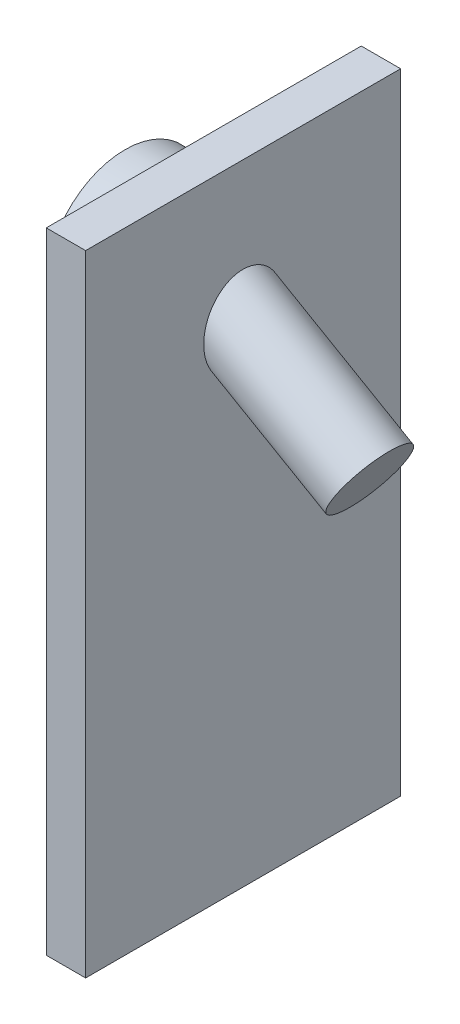
ISO-10303-21;
HEADER;
FILE_DESCRIPTION(('STEP AP214'),'2;1');
FILE_NAME('part.step','',(''),(''),'','','');
FILE_SCHEMA(('AUTOMOTIVE_DESIGN { 1 0 10303 214 1 1 1 1 }'));
ENDSEC;
DATA;
#1=APPLICATION_CONTEXT('core data for automotive mechanical design processes');
#2=APPLICATION_PROTOCOL_DEFINITION('international standard','automotive_design',2000,#1);
#3=PRODUCT_CONTEXT('',#1,'mechanical');
#4=PRODUCT('Part','Part','',(#3));
#5=PRODUCT_RELATED_PRODUCT_CATEGORY('part','',(#4));
#6=PRODUCT_DEFINITION_FORMATION('','',#4);
#7=PRODUCT_DEFINITION_CONTEXT('part definition',#1,'design');
#8=PRODUCT_DEFINITION('design','',#6,#7);
#9=PRODUCT_DEFINITION_SHAPE('','',#8);
#10=(LENGTH_UNIT() NAMED_UNIT(*) SI_UNIT(.MILLI.,.METRE.));
#11=(NAMED_UNIT(*) PLANE_ANGLE_UNIT() SI_UNIT($,.RADIAN.));
#12=(NAMED_UNIT(*) SI_UNIT($,.STERADIAN.) SOLID_ANGLE_UNIT());
#13=UNCERTAINTY_MEASURE_WITH_UNIT(LENGTH_MEASURE(1.E-05),#10,'distance_accuracy_value','');
#14=(GEOMETRIC_REPRESENTATION_CONTEXT(3) GLOBAL_UNCERTAINTY_ASSIGNED_CONTEXT((#13)) GLOBAL_UNIT_ASSIGNED_CONTEXT((#10,
#11,#12)) REPRESENTATION_CONTEXT('',''));
#15=CARTESIAN_POINT('',(0.,0.,0.));
#16=DIRECTION('',(0.,0.,1.));
#17=DIRECTION('',(1.,0.,0.));
#18=AXIS2_PLACEMENT_3D('',#15,#16,#17);
#19=CARTESIAN_POINT('',(0.,0.,25.4));
#20=DIRECTION('',(0.,1.,0.));
#21=DIRECTION('',(-1.,0.,0.));
#22=AXIS2_PLACEMENT_3D('',#19,#20,#21);
#23=PLANE('',#22);
#24=DIRECTION('',(1.,0.,0.));
#25=VECTOR('',#24,1.);
#26=CARTESIAN_POINT('',(0.,0.,0.));
#27=LINE('',#26,#25);
#28=CARTESIAN_POINT('',(-3.175,0.,0.));
#29=VERTEX_POINT('',#28);
#30=CARTESIAN_POINT('',(0.,0.,0.));
#31=VERTEX_POINT('',#30);
#32=EDGE_CURVE('E103',#29,#31,#27,.T.);
#33=ORIENTED_EDGE('',*,*,#32,.T.);
#34=DIRECTION('',(0.,0.,-1.));
#35=VECTOR('',#34,1.);
#36=CARTESIAN_POINT('',(0.,0.,25.4));
#37=LINE('',#36,#35);
#38=CARTESIAN_POINT('',(0.,0.,25.4));
#39=VERTEX_POINT('',#38);
#40=EDGE_CURVE('E45',#39,#31,#37,.T.);
#41=ORIENTED_EDGE('',*,*,#40,.F.);
#42=DIRECTION('',(1.,0.,0.));
#43=VECTOR('',#42,1.);
#44=CARTESIAN_POINT('',(0.,0.,25.4));
#45=LINE('',#44,#43);
#46=CARTESIAN_POINT('',(-3.175,0.,25.4));
#47=VERTEX_POINT('',#46);
#48=EDGE_CURVE('E89',#47,#39,#45,.T.);
#49=ORIENTED_EDGE('',*,*,#48,.F.);
#50=DIRECTION('',(0.,0.,-1.));
#51=VECTOR('',#50,1.);
#52=CARTESIAN_POINT('',(-3.175,0.,25.4));
#53=LINE('',#52,#51);
#54=EDGE_CURVE('E99',#47,#29,#53,.T.);
#55=ORIENTED_EDGE('',*,*,#54,.T.);
#56=EDGE_LOOP('',(#33,#41,#49,#55));
#57=FACE_BOUND('',#56,.T.);
#58=ADVANCED_FACE('F36',(#57),#23,.F.);
#59=CARTESIAN_POINT('',(0.,0.,25.4));
#60=DIRECTION('',(-1.,0.,0.));
#61=DIRECTION('',(0.,0.,1.));
#62=AXIS2_PLACEMENT_3D('',#59,#60,#61);
#63=PLANE('',#62);
#64=CARTESIAN_POINT('',(0.,39.4800661361229,12.7));
#65=DIRECTION('',(-1.,0.,0.));
#66=DIRECTION('',(0.,-1.,0.));
#67=AXIS2_PLACEMENT_3D('',#64,#65,#66);
#68=ELLIPSE('',#67,3.66617420935411,3.175);
#69=CARTESIAN_POINT('',(0.,35.8138919267688,12.7));
#70=VERTEX_POINT('',#69);
#71=EDGE_CURVE('E39',#70,#70,#68,.T.);
#72=ORIENTED_EDGE('',*,*,#71,.T.);
#73=EDGE_LOOP('',(#72));
#74=FACE_BOUND('',#73,.T.);
#75=DIRECTION('',(0.,1.,0.));
#76=VECTOR('',#75,1.);
#77=CARTESIAN_POINT('',(0.,0.,0.));
#78=LINE('',#77,#76);
#79=CARTESIAN_POINT('',(0.,50.8,0.));
#80=VERTEX_POINT('',#79);
#81=EDGE_CURVE('E94',#31,#80,#78,.T.);
#82=ORIENTED_EDGE('',*,*,#81,.T.);
#83=DIRECTION('',(0.,0.,-1.));
#84=VECTOR('',#83,1.);
#85=CARTESIAN_POINT('',(0.,50.8,25.4));
#86=LINE('',#85,#84);
#87=CARTESIAN_POINT('',(0.,50.8,25.4));
#88=VERTEX_POINT('',#87);
#89=EDGE_CURVE('E92',#88,#80,#86,.T.);
#90=ORIENTED_EDGE('',*,*,#89,.F.);
#91=DIRECTION('',(0.,1.,0.));
#92=VECTOR('',#91,1.);
#93=CARTESIAN_POINT('',(0.,0.,25.4));
#94=LINE('',#93,#92);
#95=EDGE_CURVE('E84',#39,#88,#94,.T.);
#96=ORIENTED_EDGE('',*,*,#95,.F.);
#97=ORIENTED_EDGE('',*,*,#40,.T.);
#98=EDGE_LOOP('',(#82,#90,#96,#97));
#99=FACE_BOUND('',#98,.T.);
#100=ADVANCED_FACE('F93',(#74,#99),#63,.F.);
#101=CARTESIAN_POINT('',(-3.175,50.8,25.4));
#102=DIRECTION('',(0.,-1.,0.));
#103=DIRECTION('',(1.,0.,0.));
#104=AXIS2_PLACEMENT_3D('',#101,#102,#103);
#105=PLANE('',#104);
#106=DIRECTION('',(-1.,0.,0.));
#107=VECTOR('',#106,1.);
#108=CARTESIAN_POINT('',(-3.175,50.8,0.));
#109=LINE('',#108,#107);
#110=CARTESIAN_POINT('',(-3.175,50.8,0.));
#111=VERTEX_POINT('',#110);
#112=EDGE_CURVE('E70',#80,#111,#109,.T.);
#113=ORIENTED_EDGE('',*,*,#112,.T.);
#114=DIRECTION('',(0.,0.,-1.));
#115=VECTOR('',#114,1.);
#116=CARTESIAN_POINT('',(-3.175,50.8,25.4));
#117=LINE('',#116,#115);
#118=CARTESIAN_POINT('',(-3.175,50.8,25.4));
#119=VERTEX_POINT('',#118);
#120=EDGE_CURVE('E95',#119,#111,#117,.T.);
#121=ORIENTED_EDGE('',*,*,#120,.F.);
#122=DIRECTION('',(-1.,0.,0.));
#123=VECTOR('',#122,1.);
#124=CARTESIAN_POINT('',(-3.175,50.8,25.4));
#125=LINE('',#124,#123);
#126=EDGE_CURVE('E87',#88,#119,#125,.T.);
#127=ORIENTED_EDGE('',*,*,#126,.F.);
#128=ORIENTED_EDGE('',*,*,#89,.T.);
#129=EDGE_LOOP('',(#113,#121,#127,#128));
#130=FACE_BOUND('',#129,.T.);
#131=ADVANCED_FACE('F97',(#130),#105,.F.);
#132=CARTESIAN_POINT('',(-3.175,0.,25.4));
#133=DIRECTION('',(1.,0.,0.));
#134=DIRECTION('',(0.,0.,-1.));
#135=AXIS2_PLACEMENT_3D('',#132,#133,#134);
#136=PLANE('',#135);
#137=CARTESIAN_POINT('',(-3.175,40.3862071410843,12.7));
#138=DIRECTION('',(1.,0.,0.));
#139=DIRECTION('',(0.,0.,-1.));
#140=AXIS2_PLACEMENT_3D('',#137,#138,#139);
#141=CIRCLE('',#140,6.35);
#142=CARTESIAN_POINT('',(-3.175,40.3862071410843,6.35));
#143=VERTEX_POINT('',#142);
#144=EDGE_CURVE('E11',#143,#143,#141,.F.);
#145=ORIENTED_EDGE('',*,*,#144,.F.);
#146=EDGE_LOOP('',(#145));
#147=FACE_BOUND('',#146,.T.);
#148=DIRECTION('',(0.,-1.,0.));
#149=VECTOR('',#148,1.);
#150=CARTESIAN_POINT('',(-3.175,0.,0.));
#151=LINE('',#150,#149);
#152=EDGE_CURVE('E76',#111,#29,#151,.T.);
#153=ORIENTED_EDGE('',*,*,#152,.T.);
#154=ORIENTED_EDGE('',*,*,#54,.F.);
#155=DIRECTION('',(0.,-1.,0.));
#156=VECTOR('',#155,1.);
#157=CARTESIAN_POINT('',(-3.175,0.,25.4));
#158=LINE('',#157,#156);
#159=EDGE_CURVE('E53',#119,#47,#158,.T.);
#160=ORIENTED_EDGE('',*,*,#159,.F.);
#161=ORIENTED_EDGE('',*,*,#120,.T.);
#162=EDGE_LOOP('',(#153,#154,#160,#161));
#163=FACE_BOUND('',#162,.T.);
#164=ADVANCED_FACE('F126',(#147,#163),#136,.F.);
#165=CARTESIAN_POINT('',(0.,0.,25.4));
#166=DIRECTION('',(0.,0.,-1.));
#167=DIRECTION('',(-1.,0.,0.));
#168=AXIS2_PLACEMENT_3D('',#165,#166,#167);
#169=PLANE('',#168);
#170=ORIENTED_EDGE('',*,*,#48,.T.);
#171=ORIENTED_EDGE('',*,*,#95,.T.);
#172=ORIENTED_EDGE('',*,*,#126,.T.);
#173=ORIENTED_EDGE('',*,*,#159,.T.);
#174=EDGE_LOOP('',(#170,#171,#172,#173));
#175=FACE_BOUND('',#174,.T.);
#176=ADVANCED_FACE('F85',(#175),#169,.F.);
#177=CARTESIAN_POINT('',(0.,0.,0.));
#178=DIRECTION('',(0.,0.,-1.));
#179=DIRECTION('',(-1.,0.,0.));
#180=AXIS2_PLACEMENT_3D('',#177,#178,#179);
#181=PLANE('',#180);
#182=ORIENTED_EDGE('',*,*,#32,.F.);
#183=ORIENTED_EDGE('',*,*,#152,.F.);
#184=ORIENTED_EDGE('',*,*,#112,.F.);
#185=ORIENTED_EDGE('',*,*,#81,.F.);
#186=EDGE_LOOP('',(#182,#183,#184,#185));
#187=FACE_BOUND('',#186,.T.);
#188=ADVANCED_FACE('F115',(#187),#181,.T.);
#189=CARTESIAN_POINT('',(-9.525,40.3862071410843,12.7));
#190=DIRECTION('',(1.,0.,0.));
#191=DIRECTION('',(0.,0.,-1.));
#192=AXIS2_PLACEMENT_3D('',#189,#190,#191);
#193=CYLINDRICAL_SURFACE('',#192,6.35);
#194=CARTESIAN_POINT('',(-9.525,40.3862071410843,12.7));
#195=DIRECTION('',(-1.,0.,0.));
#196=DIRECTION('',(0.,0.,1.));
#197=AXIS2_PLACEMENT_3D('',#194,#195,#196);
#198=CIRCLE('',#197,6.35);
#199=CARTESIAN_POINT('',(-9.525,40.3862071410843,19.05));
#200=VERTEX_POINT('',#199);
#201=EDGE_CURVE('E106',#200,#200,#198,.T.);
#202=ORIENTED_EDGE('',*,*,#201,.F.);
#203=EDGE_LOOP('',(#202));
#204=FACE_BOUND('',#203,.T.);
#205=ORIENTED_EDGE('',*,*,#144,.T.);
#206=EDGE_LOOP('',(#205));
#207=FACE_BOUND('',#206,.T.);
#208=ADVANCED_FACE('F117',(#204,#207),#193,.T.);
#209=CARTESIAN_POINT('',(-9.525,40.3862071410843,12.7));
#210=DIRECTION('',(-1.,0.,0.));
#211=DIRECTION('',(0.,0.,1.));
#212=AXIS2_PLACEMENT_3D('',#209,#210,#211);
#213=PLANE('',#212);
#214=ORIENTED_EDGE('',*,*,#201,.T.);
#215=EDGE_LOOP('',(#214));
#216=FACE_BOUND('',#215,.T.);
#217=ADVANCED_FACE('F123',(#216),#213,.T.);
#218=CARTESIAN_POINT('',(10.207903193497,33.5865304794958,12.7));
#219=DIRECTION('',(0.866025403784442,-0.499999999999995,0.));
#220=DIRECTION('',(0.499999999999995,0.866025403784442,0.));
#221=AXIS2_PLACEMENT_3D('',#218,#219,#220);
#222=CYLINDRICAL_SURFACE('',#221,3.175);
#223=CARTESIAN_POINT('',(10.207903193497,33.5865304794958,12.7));
#224=DIRECTION('',(0.866025403784442,-0.499999999999995,0.));
#225=DIRECTION('',(0.499999999999995,0.866025403784442,0.));
#226=AXIS2_PLACEMENT_3D('',#223,#224,#225);
#227=CIRCLE('',#226,3.175);
#228=CARTESIAN_POINT('',(11.795403193497,36.3361611365114,12.7));
#229=VERTEX_POINT('',#228);
#230=EDGE_CURVE('E198',#229,#229,#227,.T.);
#231=ORIENTED_EDGE('',*,*,#230,.F.);
#232=EDGE_LOOP('',(#231));
#233=FACE_BOUND('',#232,.T.);
#234=ORIENTED_EDGE('',*,*,#71,.F.);
#235=EDGE_LOOP('',(#234));
#236=FACE_BOUND('',#235,.T.);
#237=ADVANCED_FACE('F172',(#233,#236),#222,.T.);
#238=CARTESIAN_POINT('',(11.795403193497,36.3361611365114,12.7));
#239=DIRECTION('',(0.866025403784442,-0.499999999999995,0.));
#240=DIRECTION('',(0.499999999999995,0.866025403784442,0.));
#241=AXIS2_PLACEMENT_3D('',#238,#239,#240);
#242=PLANE('',#241);
#243=ORIENTED_EDGE('',*,*,#230,.T.);
#244=EDGE_LOOP('',(#243));
#245=FACE_BOUND('',#244,.T.);
#246=ADVANCED_FACE('F181',(#245),#242,.T.);
#247=CLOSED_SHELL('',(#58,#100,#131,#164,#176,#188,#208,#217,#237,#246));
#248=MANIFOLD_SOLID_BREP('B2',#247);
#249=ADVANCED_BREP_SHAPE_REPRESENTATION('',(#18,#248),#14);
#250=SHAPE_DEFINITION_REPRESENTATION(#9,#249);
ENDSEC;
END-ISO-10303-21;
